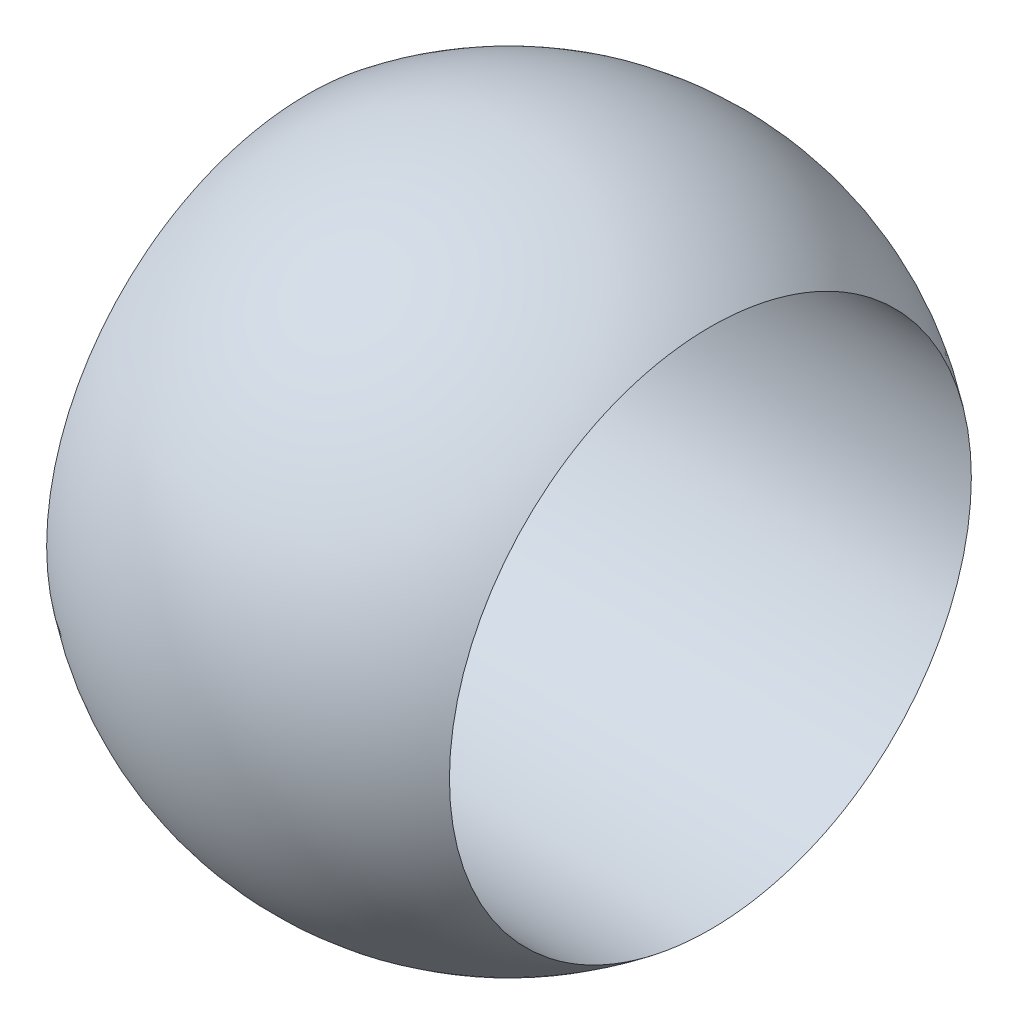
ISO-10303-21;
HEADER;
FILE_DESCRIPTION(('STEP AP214'),'2;1');
FILE_NAME('part.step','',(''),(''),'','','');
FILE_SCHEMA(('AUTOMOTIVE_DESIGN { 1 0 10303 214 1 1 1 1 }'));
ENDSEC;
DATA;
#1=APPLICATION_CONTEXT('core data for automotive mechanical design processes');
#2=APPLICATION_PROTOCOL_DEFINITION('international standard','automotive_design',2000,#1);
#3=PRODUCT_CONTEXT('',#1,'mechanical');
#4=PRODUCT('Part','Part','',(#3));
#5=PRODUCT_RELATED_PRODUCT_CATEGORY('part','',(#4));
#6=PRODUCT_DEFINITION_FORMATION('','',#4);
#7=PRODUCT_DEFINITION_CONTEXT('part definition',#1,'design');
#8=PRODUCT_DEFINITION('design','',#6,#7);
#9=PRODUCT_DEFINITION_SHAPE('','',#8);
#10=(LENGTH_UNIT() NAMED_UNIT(*) SI_UNIT(.MILLI.,.METRE.));
#11=(NAMED_UNIT(*) PLANE_ANGLE_UNIT() SI_UNIT($,.RADIAN.));
#12=(NAMED_UNIT(*) SI_UNIT($,.STERADIAN.) SOLID_ANGLE_UNIT());
#13=UNCERTAINTY_MEASURE_WITH_UNIT(LENGTH_MEASURE(1.E-05),#10,'distance_accuracy_value','');
#14=(GEOMETRIC_REPRESENTATION_CONTEXT(3) GLOBAL_UNCERTAINTY_ASSIGNED_CONTEXT((#13)) GLOBAL_UNIT_ASSIGNED_CONTEXT((#10,
#11,#12)) REPRESENTATION_CONTEXT('',''));
#15=CARTESIAN_POINT('',(0.,0.,0.));
#16=DIRECTION('',(0.,0.,1.));
#17=DIRECTION('',(1.,0.,0.));
#18=AXIS2_PLACEMENT_3D('',#15,#16,#17);
#19=CARTESIAN_POINT('',(0.,30.,0.));
#20=DIRECTION('',(0.,-1.,0.));
#21=DIRECTION('',(-1.,0.,0.));
#22=AXIS2_PLACEMENT_3D('',#19,#20,#21);
#23=SPHERICAL_SURFACE('',#22,30.);
#24=CARTESIAN_POINT('',(18.328597873269,30.,0.));
#25=DIRECTION('',(-1.,0.,0.));
#26=DIRECTION('',(0.,0.,1.));
#27=AXIS2_PLACEMENT_3D('',#24,#25,#26);
#28=CIRCLE('',#27,23.75);
#29=CARTESIAN_POINT('',(18.328597873269,30.,23.75));
#30=VERTEX_POINT('',#29);
#31=EDGE_CURVE('E44',#30,#30,#28,.F.);
#32=ORIENTED_EDGE('',*,*,#31,.F.);
#33=EDGE_LOOP('',(#32));
#34=FACE_BOUND('',#33,.T.);
#35=CARTESIAN_POINT('',(-18.328597873269,30.,0.));
#36=DIRECTION('',(1.,0.,0.));
#37=DIRECTION('',(0.,0.,-1.));
#38=AXIS2_PLACEMENT_3D('',#35,#36,#37);
#39=CIRCLE('',#38,23.75);
#40=CARTESIAN_POINT('',(-18.328597873269,30.,-23.75));
#41=VERTEX_POINT('',#40);
#42=EDGE_CURVE('E109',#41,#41,#39,.F.);
#43=ORIENTED_EDGE('',*,*,#42,.F.);
#44=EDGE_LOOP('',(#43));
#45=FACE_BOUND('',#44,.T.);
#46=CARTESIAN_POINT('',(0.,30.,5.));
#47=DIRECTION('',(0.,0.,-1.));
#48=DIRECTION('',(-1.,0.,0.));
#49=AXIS2_PLACEMENT_3D('',#46,#47,#48);
#50=CIRCLE('',#49,29.5803989154981);
#51=CARTESIAN_POINT('',(-10.,2.16117818584989,5.));
#52=VERTEX_POINT('',#51);
#53=CARTESIAN_POINT('',(10.,2.16117818584989,5.));
#54=VERTEX_POINT('',#53);
#55=EDGE_CURVE('E97',#52,#54,#50,.F.);
#56=ORIENTED_EDGE('',*,*,#55,.T.);
#57=CARTESIAN_POINT('',(10.,30.,0.));
#58=DIRECTION('',(-1.,0.,0.));
#59=DIRECTION('',(0.,0.,1.));
#60=AXIS2_PLACEMENT_3D('',#57,#58,#59);
#61=CIRCLE('',#60,28.2842712474619);
#62=CARTESIAN_POINT('',(10.,2.16117818584989,-5.));
#63=VERTEX_POINT('',#62);
#64=EDGE_CURVE('E11',#54,#63,#61,.F.);
#65=ORIENTED_EDGE('',*,*,#64,.T.);
#66=CARTESIAN_POINT('',(0.,30.,-5.));
#67=DIRECTION('',(0.,0.,1.));
#68=DIRECTION('',(1.,0.,0.));
#69=AXIS2_PLACEMENT_3D('',#66,#67,#68);
#70=CIRCLE('',#69,29.5803989154981);
#71=CARTESIAN_POINT('',(-10.,2.16117818584989,-5.));
#72=VERTEX_POINT('',#71);
#73=EDGE_CURVE('E49',#63,#72,#70,.F.);
#74=ORIENTED_EDGE('',*,*,#73,.T.);
#75=CARTESIAN_POINT('',(-10.,30.,0.));
#76=DIRECTION('',(1.,0.,0.));
#77=DIRECTION('',(0.,0.,-1.));
#78=AXIS2_PLACEMENT_3D('',#75,#76,#77);
#79=CIRCLE('',#78,28.2842712474619);
#80=EDGE_CURVE('E101',#72,#52,#79,.F.);
#81=ORIENTED_EDGE('',*,*,#80,.T.);
#82=EDGE_LOOP('',(#56,#65,#74,#81));
#83=FACE_BOUND('',#82,.T.);
#84=ADVANCED_FACE('F41',(#34,#45,#83),#23,.T.);
#85=CARTESIAN_POINT('',(10.,6.,5.));
#86=DIRECTION('',(-1.,0.,0.));
#87=DIRECTION('',(0.,0.,1.));
#88=AXIS2_PLACEMENT_3D('',#85,#86,#87);
#89=PLANE('',#88);
#90=DIRECTION('',(0.,-1.,0.));
#91=VECTOR('',#90,1.);
#92=CARTESIAN_POINT('',(10.,6.,5.));
#93=LINE('',#92,#91);
#94=CARTESIAN_POINT('',(10.,6.,5.));
#95=VERTEX_POINT('',#94);
#96=EDGE_CURVE('E57',#95,#54,#93,.T.);
#97=ORIENTED_EDGE('',*,*,#96,.F.);
#98=DIRECTION('',(0.,0.,-1.));
#99=VECTOR('',#98,1.);
#100=CARTESIAN_POINT('',(10.,6.,5.));
#101=LINE('',#100,#99);
#102=CARTESIAN_POINT('',(10.,6.,-5.));
#103=VERTEX_POINT('',#102);
#104=EDGE_CURVE('E88',#95,#103,#101,.T.);
#105=ORIENTED_EDGE('',*,*,#104,.T.);
#106=DIRECTION('',(0.,-1.,0.));
#107=VECTOR('',#106,1.);
#108=CARTESIAN_POINT('',(10.,6.,-5.));
#109=LINE('',#108,#107);
#110=EDGE_CURVE('E94',#103,#63,#109,.T.);
#111=ORIENTED_EDGE('',*,*,#110,.T.);
#112=ORIENTED_EDGE('',*,*,#64,.F.);
#113=EDGE_LOOP('',(#97,#105,#111,#112));
#114=FACE_BOUND('',#113,.T.);
#115=ADVANCED_FACE('F93',(#114),#89,.T.);
#116=CARTESIAN_POINT('',(-10.,6.,-5.));
#117=DIRECTION('',(0.,0.,1.));
#118=DIRECTION('',(1.,0.,0.));
#119=AXIS2_PLACEMENT_3D('',#116,#117,#118);
#120=PLANE('',#119);
#121=ORIENTED_EDGE('',*,*,#110,.F.);
#122=DIRECTION('',(-1.,0.,0.));
#123=VECTOR('',#122,1.);
#124=CARTESIAN_POINT('',(-10.,6.,-5.));
#125=LINE('',#124,#123);
#126=CARTESIAN_POINT('',(-10.,6.,-5.));
#127=VERTEX_POINT('',#126);
#128=EDGE_CURVE('E84',#103,#127,#125,.T.);
#129=ORIENTED_EDGE('',*,*,#128,.T.);
#130=DIRECTION('',(0.,-1.,0.));
#131=VECTOR('',#130,1.);
#132=CARTESIAN_POINT('',(-10.,6.,-5.));
#133=LINE('',#132,#131);
#134=EDGE_CURVE('E98',#127,#72,#133,.T.);
#135=ORIENTED_EDGE('',*,*,#134,.T.);
#136=ORIENTED_EDGE('',*,*,#73,.F.);
#137=EDGE_LOOP('',(#121,#129,#135,#136));
#138=FACE_BOUND('',#137,.T.);
#139=ADVANCED_FACE('F96',(#138),#120,.T.);
#140=CARTESIAN_POINT('',(-10.,6.,5.));
#141=DIRECTION('',(1.,0.,0.));
#142=DIRECTION('',(0.,0.,-1.));
#143=AXIS2_PLACEMENT_3D('',#140,#141,#142);
#144=PLANE('',#143);
#145=ORIENTED_EDGE('',*,*,#134,.F.);
#146=DIRECTION('',(0.,0.,1.));
#147=VECTOR('',#146,1.);
#148=CARTESIAN_POINT('',(-10.,6.,5.));
#149=LINE('',#148,#147);
#150=CARTESIAN_POINT('',(-10.,6.,5.));
#151=VERTEX_POINT('',#150);
#152=EDGE_CURVE('E89',#127,#151,#149,.T.);
#153=ORIENTED_EDGE('',*,*,#152,.T.);
#154=DIRECTION('',(0.,-1.,0.));
#155=VECTOR('',#154,1.);
#156=CARTESIAN_POINT('',(-10.,6.,5.));
#157=LINE('',#156,#155);
#158=EDGE_CURVE('E103',#151,#52,#157,.T.);
#159=ORIENTED_EDGE('',*,*,#158,.T.);
#160=ORIENTED_EDGE('',*,*,#80,.F.);
#161=EDGE_LOOP('',(#145,#153,#159,#160));
#162=FACE_BOUND('',#161,.T.);
#163=ADVANCED_FACE('F125',(#162),#144,.T.);
#164=CARTESIAN_POINT('',(-10.,6.,5.));
#165=DIRECTION('',(0.,0.,-1.));
#166=DIRECTION('',(-1.,0.,0.));
#167=AXIS2_PLACEMENT_3D('',#164,#165,#166);
#168=PLANE('',#167);
#169=ORIENTED_EDGE('',*,*,#158,.F.);
#170=DIRECTION('',(1.,0.,0.));
#171=VECTOR('',#170,1.);
#172=CARTESIAN_POINT('',(-10.,6.,5.));
#173=LINE('',#172,#171);
#174=EDGE_CURVE('E126',#151,#95,#173,.T.);
#175=ORIENTED_EDGE('',*,*,#174,.T.);
#176=ORIENTED_EDGE('',*,*,#96,.T.);
#177=ORIENTED_EDGE('',*,*,#55,.F.);
#178=EDGE_LOOP('',(#169,#175,#176,#177));
#179=FACE_BOUND('',#178,.T.);
#180=ADVANCED_FACE('F123',(#179),#168,.T.);
#181=CARTESIAN_POINT('',(0.,6.,0.));
#182=DIRECTION('',(0.,-1.,0.));
#183=DIRECTION('',(0.,0.,-1.));
#184=AXIS2_PLACEMENT_3D('',#181,#182,#183);
#185=PLANE('',#184);
#186=ORIENTED_EDGE('',*,*,#104,.F.);
#187=ORIENTED_EDGE('',*,*,#174,.F.);
#188=ORIENTED_EDGE('',*,*,#152,.F.);
#189=ORIENTED_EDGE('',*,*,#128,.F.);
#190=EDGE_LOOP('',(#186,#187,#188,#189));
#191=FACE_BOUND('',#190,.T.);
#192=ADVANCED_FACE('F86',(#191),#185,.T.);
#193=CARTESIAN_POINT('',(-30.,30.,0.));
#194=DIRECTION('',(1.,0.,0.));
#195=DIRECTION('',(0.,0.,-1.));
#196=AXIS2_PLACEMENT_3D('',#193,#194,#195);
#197=CYLINDRICAL_SURFACE('',#196,23.75);
#198=ORIENTED_EDGE('',*,*,#31,.T.);
#199=EDGE_LOOP('',(#198));
#200=FACE_BOUND('',#199,.T.);
#201=ORIENTED_EDGE('',*,*,#42,.T.);
#202=EDGE_LOOP('',(#201));
#203=FACE_BOUND('',#202,.T.);
#204=ADVANCED_FACE('F116',(#200,#203),#197,.F.);
#205=CLOSED_SHELL('',(#84,#115,#139,#163,#180,#192,#204));
#206=MANIFOLD_SOLID_BREP('B2',#205);
#207=ADVANCED_BREP_SHAPE_REPRESENTATION('',(#18,#206),#14);
#208=SHAPE_DEFINITION_REPRESENTATION(#9,#207);
ENDSEC;
END-ISO-10303-21;
